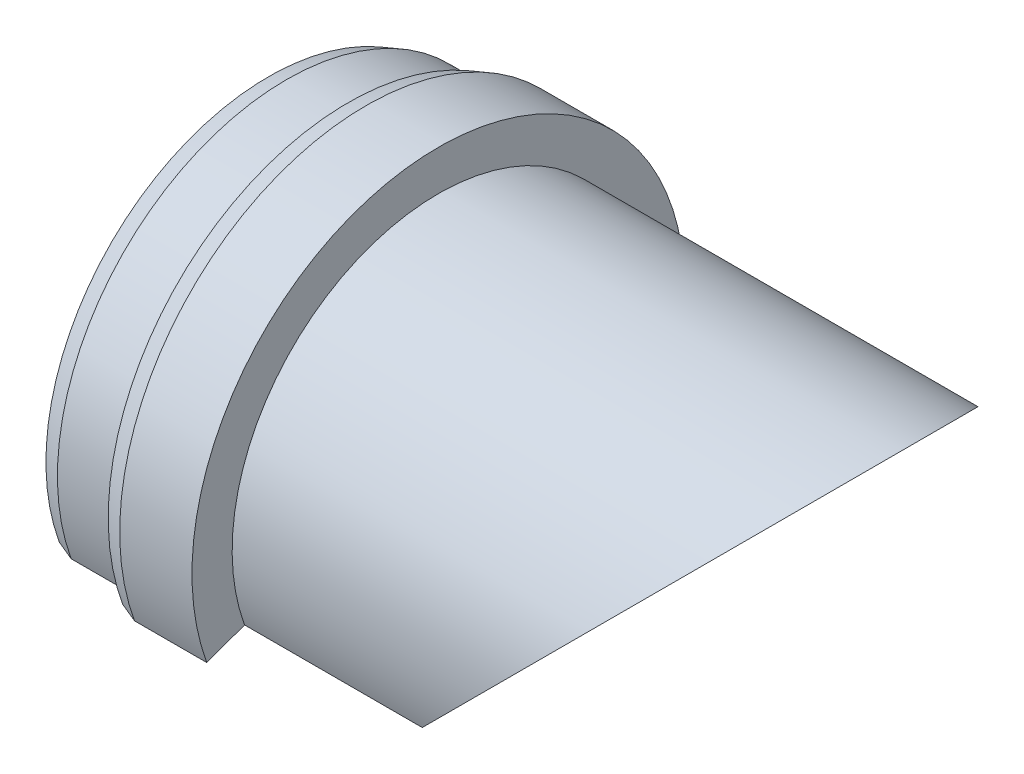
ISO-10303-21;
HEADER;
FILE_DESCRIPTION(('STEP AP214'),'2;1');
FILE_NAME('part.step','',(''),(''),'','','');
FILE_SCHEMA(('AUTOMOTIVE_DESIGN { 1 0 10303 214 1 1 1 1 }'));
ENDSEC;
DATA;
#1=APPLICATION_CONTEXT('core data for automotive mechanical design processes');
#2=APPLICATION_PROTOCOL_DEFINITION('international standard','automotive_design',2000,#1);
#3=PRODUCT_CONTEXT('',#1,'mechanical');
#4=PRODUCT('Part','Part','',(#3));
#5=PRODUCT_RELATED_PRODUCT_CATEGORY('part','',(#4));
#6=PRODUCT_DEFINITION_FORMATION('','',#4);
#7=PRODUCT_DEFINITION_CONTEXT('part definition',#1,'design');
#8=PRODUCT_DEFINITION('design','',#6,#7);
#9=PRODUCT_DEFINITION_SHAPE('','',#8);
#10=(LENGTH_UNIT() NAMED_UNIT(*) SI_UNIT(.MILLI.,.METRE.));
#11=(NAMED_UNIT(*) PLANE_ANGLE_UNIT() SI_UNIT($,.RADIAN.));
#12=(NAMED_UNIT(*) SI_UNIT($,.STERADIAN.) SOLID_ANGLE_UNIT());
#13=UNCERTAINTY_MEASURE_WITH_UNIT(LENGTH_MEASURE(1.E-05),#10,'distance_accuracy_value','');
#14=(GEOMETRIC_REPRESENTATION_CONTEXT(3) GLOBAL_UNCERTAINTY_ASSIGNED_CONTEXT((#13)) GLOBAL_UNIT_ASSIGNED_CONTEXT((#10,
#11,#12)) REPRESENTATION_CONTEXT('',''));
#15=CARTESIAN_POINT('',(0.,0.,0.));
#16=DIRECTION('',(0.,0.,1.));
#17=DIRECTION('',(1.,0.,0.));
#18=AXIS2_PLACEMENT_3D('',#15,#16,#17);
#19=CARTESIAN_POINT('',(0.,0.,0.));
#20=DIRECTION('',(-1.,0.,0.));
#21=DIRECTION('',(0.,0.,1.));
#22=AXIS2_PLACEMENT_3D('',#19,#20,#21);
#23=CYLINDRICAL_SURFACE('',#22,55.05);
#24=CARTESIAN_POINT('',(0.,0.,0.));
#25=DIRECTION('',(-1.,0.,0.));
#26=DIRECTION('',(0.,0.,1.));
#27=AXIS2_PLACEMENT_3D('',#24,#25,#26);
#28=CIRCLE('',#27,55.05);
#29=CARTESIAN_POINT('',(0.,-18.8282088900778,51.7300787742644));
#30=VERTEX_POINT('',#29);
#31=CARTESIAN_POINT('',(0.,-54.213666803322,-9.55933218056476));
#32=VERTEX_POINT('',#31);
#33=EDGE_CURVE('E123',#30,#32,#28,.T.);
#34=ORIENTED_EDGE('',*,*,#33,.T.);
#35=DIRECTION('',(-1.,0.,0.));
#36=VECTOR('',#35,1.);
#37=CARTESIAN_POINT('',(0.,-54.213666803322,-9.55933218056476));
#38=LINE('',#37,#36);
#39=CARTESIAN_POINT('',(61.4763331966769,-54.213666803322,-9.55933218056476));
#40=VERTEX_POINT('',#39);
#41=EDGE_CURVE('E164',#32,#40,#38,.F.);
#42=ORIENTED_EDGE('',*,*,#41,.T.);
#43=CARTESIAN_POINT('',(115.689999999999,0.,0.));
#44=DIRECTION('',(-0.707106781186544,0.707106781186551,0.));
#45=DIRECTION('',(-0.707106781186551,-0.707106781186544,0.));
#46=AXIS2_PLACEMENT_3D('',#43,#44,#45);
#47=ELLIPSE('',#46,77.8524566086393,55.05);
#48=CARTESIAN_POINT('',(96.8617911099215,-18.8282088900778,51.7300787742644));
#49=VERTEX_POINT('',#48);
#50=EDGE_CURVE('E138',#40,#49,#47,.F.);
#51=ORIENTED_EDGE('',*,*,#50,.T.);
#52=DIRECTION('',(-1.,0.,0.));
#53=VECTOR('',#52,1.);
#54=CARTESIAN_POINT('',(0.,-18.8282088900778,51.7300787742644));
#55=LINE('',#54,#53);
#56=EDGE_CURVE('E188',#49,#30,#55,.T.);
#57=ORIENTED_EDGE('',*,*,#56,.T.);
#58=EDGE_LOOP('',(#34,#42,#51,#57));
#59=FACE_BOUND('',#58,.T.);
#60=ADVANCED_FACE('F35',(#59),#23,.F.);
#61=CARTESIAN_POINT('',(0.,0.,0.));
#62=DIRECTION('',(-1.,0.,0.));
#63=DIRECTION('',(0.,0.,1.));
#64=AXIS2_PLACEMENT_3D('',#61,#62,#63);
#65=CYLINDRICAL_SURFACE('',#64,57.05);
#66=CARTESIAN_POINT('',(115.689999999999,0.,0.));
#67=DIRECTION('',(-0.707106781186544,0.707106781186551,0.));
#68=DIRECTION('',(-0.707106781186551,-0.707106781186544,0.));
#69=AXIS2_PLACEMENT_3D('',#66,#67,#68);
#70=ELLIPSE('',#69,80.6808837333855,57.05);
#71=CARTESIAN_POINT('',(96.1777508232702,-19.5122491767291,53.6094640158362));
#72=VERTEX_POINT('',#71);
#73=CARTESIAN_POINT('',(59.5067176906524,-56.1832823093464,-9.90662853589863));
#74=VERTEX_POINT('',#73);
#75=EDGE_CURVE('E135',#72,#74,#70,.T.);
#76=ORIENTED_EDGE('',*,*,#75,.T.);
#77=DIRECTION('',(-1.,0.,0.));
#78=VECTOR('',#77,1.);
#79=CARTESIAN_POINT('',(0.,-56.1832823093464,-9.90662853589863));
#80=LINE('',#79,#78);
#81=CARTESIAN_POINT('',(47.,-56.1832823093464,-9.90662853589863));
#82=VERTEX_POINT('',#81);
#83=EDGE_CURVE('E139',#74,#82,#80,.T.);
#84=ORIENTED_EDGE('',*,*,#83,.T.);
#85=CARTESIAN_POINT('',(47.,0.,0.));
#86=DIRECTION('',(-1.,0.,0.));
#87=DIRECTION('',(0.,0.,1.));
#88=AXIS2_PLACEMENT_3D('',#85,#86,#87);
#89=CIRCLE('',#88,57.05);
#90=CARTESIAN_POINT('',(47.,-19.5122491767291,53.6094640158362));
#91=VERTEX_POINT('',#90);
#92=EDGE_CURVE('E134',#91,#82,#89,.T.);
#93=ORIENTED_EDGE('',*,*,#92,.F.);
#94=DIRECTION('',(-1.,0.,0.));
#95=VECTOR('',#94,1.);
#96=CARTESIAN_POINT('',(0.,-19.5122491767291,53.6094640158362));
#97=LINE('',#96,#95);
#98=EDGE_CURVE('E174',#91,#72,#97,.F.);
#99=ORIENTED_EDGE('',*,*,#98,.T.);
#100=EDGE_LOOP('',(#76,#84,#93,#99));
#101=FACE_BOUND('',#100,.T.);
#102=ADVANCED_FACE('F212',(#101),#65,.T.);
#103=CARTESIAN_POINT('',(47.,0.,0.));
#104=DIRECTION('',(-1.,0.,0.));
#105=DIRECTION('',(0.,0.,1.));
#106=AXIS2_PLACEMENT_3D('',#103,#104,#105);
#107=PLANE('',#106);
#108=ORIENTED_EDGE('',*,*,#92,.T.);
#109=DIRECTION('',(0.,-0.984807753012207,-0.173648177666935));
#110=VECTOR('',#109,1.);
#111=CARTESIAN_POINT('',(47.,0.,0.));
#112=LINE('',#111,#110);
#113=CARTESIAN_POINT('',(47.,-67.1294204840771,-11.8367280306666));
#114=VERTEX_POINT('',#113);
#115=EDGE_CURVE('E153',#82,#114,#112,.T.);
#116=ORIENTED_EDGE('',*,*,#115,.T.);
#117=CARTESIAN_POINT('',(47.,0.,0.));
#118=DIRECTION('',(-1.,0.,0.));
#119=DIRECTION('',(0.,0.,1.));
#120=AXIS2_PLACEMENT_3D('',#117,#118,#119);
#121=CIRCLE('',#120,68.165);
#122=CARTESIAN_POINT('',(47.,-23.3138030697938,64.0541474958716));
#123=VERTEX_POINT('',#122);
#124=EDGE_CURVE('E142',#123,#114,#121,.T.);
#125=ORIENTED_EDGE('',*,*,#124,.F.);
#126=DIRECTION('',(0.,0.342020143325663,-0.939692620785911));
#127=VECTOR('',#126,1.);
#128=CARTESIAN_POINT('',(47.,0.,0.));
#129=LINE('',#128,#127);
#130=EDGE_CURVE('E177',#123,#91,#129,.T.);
#131=ORIENTED_EDGE('',*,*,#130,.T.);
#132=EDGE_LOOP('',(#108,#116,#125,#131));
#133=FACE_BOUND('',#132,.T.);
#134=ADVANCED_FACE('F209',(#133),#107,.F.);
#135=CARTESIAN_POINT('',(0.,0.,0.));
#136=DIRECTION('',(-1.,0.,0.));
#137=DIRECTION('',(0.,0.,1.));
#138=AXIS2_PLACEMENT_3D('',#135,#136,#137);
#139=CYLINDRICAL_SURFACE('',#138,68.165);
#140=ORIENTED_EDGE('',*,*,#124,.T.);
#141=DIRECTION('',(-1.,0.,0.));
#142=VECTOR('',#141,1.);
#143=CARTESIAN_POINT('',(0.,-67.1294204840771,-11.8367280306666));
#144=LINE('',#143,#142);
#145=CARTESIAN_POINT('',(26.9999999999999,-67.1294204840771,-11.8367280306666));
#146=VERTEX_POINT('',#145);
#147=EDGE_CURVE('E156',#114,#146,#144,.T.);
#148=ORIENTED_EDGE('',*,*,#147,.T.);
#149=CARTESIAN_POINT('',(26.9999999999999,0.,0.));
#150=DIRECTION('',(1.,0.,0.));
#151=DIRECTION('',(0.,0.,-1.));
#152=AXIS2_PLACEMENT_3D('',#149,#150,#151);
#153=CIRCLE('',#152,68.165);
#154=CARTESIAN_POINT('',(26.9999999999999,-23.3138030697938,64.0541474958716));
#155=VERTEX_POINT('',#154);
#156=EDGE_CURVE('E125',#146,#155,#153,.T.);
#157=ORIENTED_EDGE('',*,*,#156,.T.);
#158=DIRECTION('',(-1.,0.,0.));
#159=VECTOR('',#158,1.);
#160=CARTESIAN_POINT('',(0.,-23.3138030697938,64.0541474958716));
#161=LINE('',#160,#159);
#162=EDGE_CURVE('E180',#155,#123,#161,.F.);
#163=ORIENTED_EDGE('',*,*,#162,.T.);
#164=EDGE_LOOP('',(#140,#148,#157,#163));
#165=FACE_BOUND('',#164,.T.);
#166=ADVANCED_FACE('F206',(#165),#139,.T.);
#167=CARTESIAN_POINT('',(22.,0.,0.));
#168=DIRECTION('',(1.,0.,0.));
#169=DIRECTION('',(0.,0.,-1.));
#170=AXIS2_PLACEMENT_3D('',#167,#168,#169);
#171=PLANE('',#170);
#172=CARTESIAN_POINT('',(22.,0.,0.));
#173=DIRECTION('',(1.,0.,0.));
#174=DIRECTION('',(0.,0.,-1.));
#175=AXIS2_PLACEMENT_3D('',#172,#173,#174);
#176=CIRCLE('',#175,66.345148828669);
#177=CARTESIAN_POINT('',(22.,-22.6913773113438,62.3440467792433));
#178=VERTEX_POINT('',#177);
#179=CARTESIAN_POINT('',(22.,-65.337216941222,-11.5207141911399));
#180=VERTEX_POINT('',#179);
#181=EDGE_CURVE('E129',#178,#180,#176,.F.);
#182=ORIENTED_EDGE('',*,*,#181,.T.);
#183=DIRECTION('',(0.,0.984807753012207,0.173648177666935));
#184=VECTOR('',#183,1.);
#185=CARTESIAN_POINT('',(22.,0.,0.));
#186=LINE('',#185,#184);
#187=CARTESIAN_POINT('',(22.,-62.4368115409739,-11.0092944640837));
#188=VERTEX_POINT('',#187);
#189=EDGE_CURVE('E167',#180,#188,#186,.T.);
#190=ORIENTED_EDGE('',*,*,#189,.T.);
#191=CARTESIAN_POINT('',(22.,0.,0.));
#192=DIRECTION('',(-1.,0.,0.));
#193=DIRECTION('',(0.,0.,1.));
#194=AXIS2_PLACEMENT_3D('',#191,#192,#193);
#195=CIRCLE('',#194,63.4);
#196=CARTESIAN_POINT('',(22.,-21.684077086847,59.5765121578267));
#197=VERTEX_POINT('',#196);
#198=EDGE_CURVE('E145',#197,#188,#195,.T.);
#199=ORIENTED_EDGE('',*,*,#198,.F.);
#200=DIRECTION('',(0.,-0.342020143325663,0.939692620785911));
#201=VECTOR('',#200,1.);
#202=CARTESIAN_POINT('',(22.,0.,0.));
#203=LINE('',#202,#201);
#204=EDGE_CURVE('E190',#197,#178,#203,.T.);
#205=ORIENTED_EDGE('',*,*,#204,.T.);
#206=EDGE_LOOP('',(#182,#190,#199,#205));
#207=FACE_BOUND('',#206,.T.);
#208=ADVANCED_FACE('F197',(#207),#171,.F.);
#209=CARTESIAN_POINT('',(0.,0.,0.));
#210=DIRECTION('',(-1.,0.,0.));
#211=DIRECTION('',(0.,0.,1.));
#212=AXIS2_PLACEMENT_3D('',#209,#210,#211);
#213=CYLINDRICAL_SURFACE('',#212,63.4);
#214=ORIENTED_EDGE('',*,*,#198,.T.);
#215=DIRECTION('',(-1.,0.,0.));
#216=VECTOR('',#215,1.);
#217=CARTESIAN_POINT('',(0.,-62.4368115409739,-11.0092944640837));
#218=LINE('',#217,#216);
#219=CARTESIAN_POINT('',(4.99999999999995,-62.4368115409739,-11.0092944640837));
#220=VERTEX_POINT('',#219);
#221=EDGE_CURVE('E170',#188,#220,#218,.T.);
#222=ORIENTED_EDGE('',*,*,#221,.T.);
#223=CARTESIAN_POINT('',(4.99999999999995,0.,0.));
#224=DIRECTION('',(1.,0.,0.));
#225=DIRECTION('',(0.,0.,-1.));
#226=AXIS2_PLACEMENT_3D('',#223,#224,#225);
#227=CIRCLE('',#226,63.4);
#228=CARTESIAN_POINT('',(4.99999999999995,-21.684077086847,59.5765121578267));
#229=VERTEX_POINT('',#228);
#230=EDGE_CURVE('E116',#220,#229,#227,.T.);
#231=ORIENTED_EDGE('',*,*,#230,.T.);
#232=DIRECTION('',(-1.,0.,0.));
#233=VECTOR('',#232,1.);
#234=CARTESIAN_POINT('',(0.,-21.684077086847,59.5765121578267));
#235=LINE('',#234,#233);
#236=EDGE_CURVE('E57',#229,#197,#235,.F.);
#237=ORIENTED_EDGE('',*,*,#236,.T.);
#238=EDGE_LOOP('',(#214,#222,#231,#237));
#239=FACE_BOUND('',#238,.T.);
#240=ADVANCED_FACE('F195',(#239),#213,.T.);
#241=CARTESIAN_POINT('',(0.,0.,0.));
#242=DIRECTION('',(1.,0.,0.));
#243=DIRECTION('',(0.,0.,-1.));
#244=AXIS2_PLACEMENT_3D('',#241,#242,#243);
#245=PLANE('',#244);
#246=CARTESIAN_POINT('',(0.,0.,0.));
#247=DIRECTION('',(1.,0.,0.));
#248=DIRECTION('',(0.,0.,-1.));
#249=AXIS2_PLACEMENT_3D('',#246,#247,#248);
#250=CIRCLE('',#249,61.580148828669);
#251=CARTESIAN_POINT('',(0.,-21.061651328397,57.8664114411984));
#252=VERTEX_POINT('',#251);
#253=CARTESIAN_POINT('',(0.,-60.6446079981188,-10.693280624557));
#254=VERTEX_POINT('',#253);
#255=EDGE_CURVE('E121',#252,#254,#250,.F.);
#256=ORIENTED_EDGE('',*,*,#255,.T.);
#257=DIRECTION('',(0.,0.984807753012207,0.173648177666935));
#258=VECTOR('',#257,1.);
#259=CARTESIAN_POINT('',(0.,0.,0.));
#260=LINE('',#259,#258);
#261=EDGE_CURVE('E49',#254,#32,#260,.T.);
#262=ORIENTED_EDGE('',*,*,#261,.T.);
#263=ORIENTED_EDGE('',*,*,#33,.F.);
#264=DIRECTION('',(0.,-0.342020143325663,0.939692620785911));
#265=VECTOR('',#264,1.);
#266=CARTESIAN_POINT('',(0.,0.,0.));
#267=LINE('',#266,#265);
#268=EDGE_CURVE('E110',#30,#252,#267,.T.);
#269=ORIENTED_EDGE('',*,*,#268,.T.);
#270=EDGE_LOOP('',(#256,#262,#263,#269));
#271=FACE_BOUND('',#270,.T.);
#272=ADVANCED_FACE('F120',(#271),#245,.F.);
#273=CARTESIAN_POINT('',(57.8449999999991,-57.8449999999997,-68.165));
#274=DIRECTION('',(-0.707106781186544,0.707106781186551,0.));
#275=DIRECTION('',(-0.707106781186551,-0.707106781186544,0.));
#276=AXIS2_PLACEMENT_3D('',#273,#274,#275);
#277=PLANE('',#276);
#278=ORIENTED_EDGE('',*,*,#50,.F.);
#279=DIRECTION('',(-0.701673843159867,-0.701673843159859,-0.123724030206486));
#280=VECTOR('',#279,1.);
#281=CARTESIAN_POINT('',(52.8127996160005,-62.8772003839983,-11.0869468991118));
#282=LINE('',#281,#280);
#283=EDGE_CURVE('E159',#40,#74,#282,.T.);
#284=ORIENTED_EDGE('',*,*,#283,.T.);
#285=ORIENTED_EDGE('',*,*,#75,.F.);
#286=DIRECTION('',(0.323615577118183,0.32361557711818,-0.889126490715991));
#287=VECTOR('',#286,1.);
#288=CARTESIAN_POINT('',(123.187597249473,7.49759724947371,-20.5994791430945));
#289=LINE('',#288,#287);
#290=EDGE_CURVE('E183',#72,#49,#289,.T.);
#291=ORIENTED_EDGE('',*,*,#290,.T.);
#292=EDGE_LOOP('',(#278,#284,#285,#291));
#293=FACE_BOUND('',#292,.T.);
#294=ADVANCED_FACE('F216',(#293),#277,.F.);
#295=CARTESIAN_POINT('',(22.,0.,0.));
#296=DIRECTION('',(1.,0.,0.));
#297=DIRECTION('',(0.,0.,-1.));
#298=AXIS2_PLACEMENT_3D('',#295,#296,#297);
#299=CONICAL_SURFACE('',#298,66.345148828669,0.349065850398867);
#300=DIRECTION('',(-0.939692620785908,0.336824088833466,0.0593911746138864));
#301=VECTOR('',#300,1.);
#302=CARTESIAN_POINT('',(-160.281798297124,0.,0.));
#303=LINE('',#302,#301);
#304=EDGE_CURVE('E162',#180,#146,#303,.F.);
#305=ORIENTED_EDGE('',*,*,#304,.F.);
#306=ORIENTED_EDGE('',*,*,#181,.F.);
#307=DIRECTION('',(0.939692620785908,-0.116977778440509,0.321393804843271));
#308=VECTOR('',#307,1.);
#309=CARTESIAN_POINT('',(-160.281798297124,0.,0.));
#310=LINE('',#309,#308);
#311=EDGE_CURVE('E186',#155,#178,#310,.F.);
#312=ORIENTED_EDGE('',*,*,#311,.F.);
#313=ORIENTED_EDGE('',*,*,#156,.F.);
#314=EDGE_LOOP('',(#305,#306,#312,#313));
#315=FACE_BOUND('',#314,.T.);
#316=ADVANCED_FACE('F203',(#315),#299,.T.);
#317=CARTESIAN_POINT('',(0.,0.,0.));
#318=DIRECTION('',(1.,0.,0.));
#319=DIRECTION('',(0.,0.,-1.));
#320=AXIS2_PLACEMENT_3D('',#317,#318,#319);
#321=CONICAL_SURFACE('',#320,61.580148828669,0.349065850398868);
#322=DIRECTION('',(-0.939692620785908,0.336824088833467,0.0593911746138865));
#323=VECTOR('',#322,1.);
#324=CARTESIAN_POINT('',(-169.190068393422,0.,0.));
#325=LINE('',#324,#323);
#326=EDGE_CURVE('E11',#254,#220,#325,.F.);
#327=ORIENTED_EDGE('',*,*,#326,.F.);
#328=ORIENTED_EDGE('',*,*,#255,.F.);
#329=DIRECTION('',(0.939692620785908,-0.11697777844051,0.321393804843272));
#330=VECTOR('',#329,1.);
#331=CARTESIAN_POINT('',(-169.190068393422,0.,0.));
#332=LINE('',#331,#330);
#333=EDGE_CURVE('E43',#229,#252,#332,.F.);
#334=ORIENTED_EDGE('',*,*,#333,.F.);
#335=ORIENTED_EDGE('',*,*,#230,.F.);
#336=EDGE_LOOP('',(#327,#328,#334,#335));
#337=FACE_BOUND('',#336,.T.);
#338=ADVANCED_FACE('F37',(#337),#321,.T.);
#339=CARTESIAN_POINT('',(-1.2E-05,0.,0.));
#340=DIRECTION('',(0.,0.939692620785911,0.342020143325663));
#341=DIRECTION('',(0.,-0.342020143325663,0.939692620785911));
#342=AXIS2_PLACEMENT_3D('',#339,#340,#341);
#343=PLANE('',#342);
#344=ORIENTED_EDGE('',*,*,#130,.F.);
#345=ORIENTED_EDGE('',*,*,#162,.F.);
#346=ORIENTED_EDGE('',*,*,#311,.T.);
#347=ORIENTED_EDGE('',*,*,#204,.F.);
#348=ORIENTED_EDGE('',*,*,#236,.F.);
#349=ORIENTED_EDGE('',*,*,#333,.T.);
#350=ORIENTED_EDGE('',*,*,#268,.F.);
#351=ORIENTED_EDGE('',*,*,#56,.F.);
#352=ORIENTED_EDGE('',*,*,#290,.F.);
#353=ORIENTED_EDGE('',*,*,#98,.F.);
#354=EDGE_LOOP('',(#344,#345,#346,#347,#348,#349,#350,#351,#352,#353));
#355=FACE_BOUND('',#354,.T.);
#356=ADVANCED_FACE('F109',(#355),#343,.F.);
#357=CARTESIAN_POINT('',(-1.2E-05,-110.,-19.3959678779316));
#358=DIRECTION('',(0.,0.173648177666935,-0.984807753012207));
#359=DIRECTION('',(0.,0.984807753012207,0.173648177666935));
#360=AXIS2_PLACEMENT_3D('',#357,#358,#359);
#361=PLANE('',#360);
#362=ORIENTED_EDGE('',*,*,#283,.F.);
#363=ORIENTED_EDGE('',*,*,#41,.F.);
#364=ORIENTED_EDGE('',*,*,#261,.F.);
#365=ORIENTED_EDGE('',*,*,#326,.T.);
#366=ORIENTED_EDGE('',*,*,#221,.F.);
#367=ORIENTED_EDGE('',*,*,#189,.F.);
#368=ORIENTED_EDGE('',*,*,#304,.T.);
#369=ORIENTED_EDGE('',*,*,#147,.F.);
#370=ORIENTED_EDGE('',*,*,#115,.F.);
#371=ORIENTED_EDGE('',*,*,#83,.F.);
#372=EDGE_LOOP('',(#362,#363,#364,#365,#366,#367,#368,#369,#370,#371));
#373=FACE_BOUND('',#372,.T.);
#374=ADVANCED_FACE('F200',(#373),#361,.F.);
#375=CLOSED_SHELL('',(#60,#102,#134,#166,#208,#240,#272,#294,#316,#338,#356,#374));
#376=MANIFOLD_SOLID_BREP('B2',#375);
#377=ADVANCED_BREP_SHAPE_REPRESENTATION('',(#18,#376),#14);
#378=SHAPE_DEFINITION_REPRESENTATION(#9,#377);
ENDSEC;
END-ISO-10303-21;
